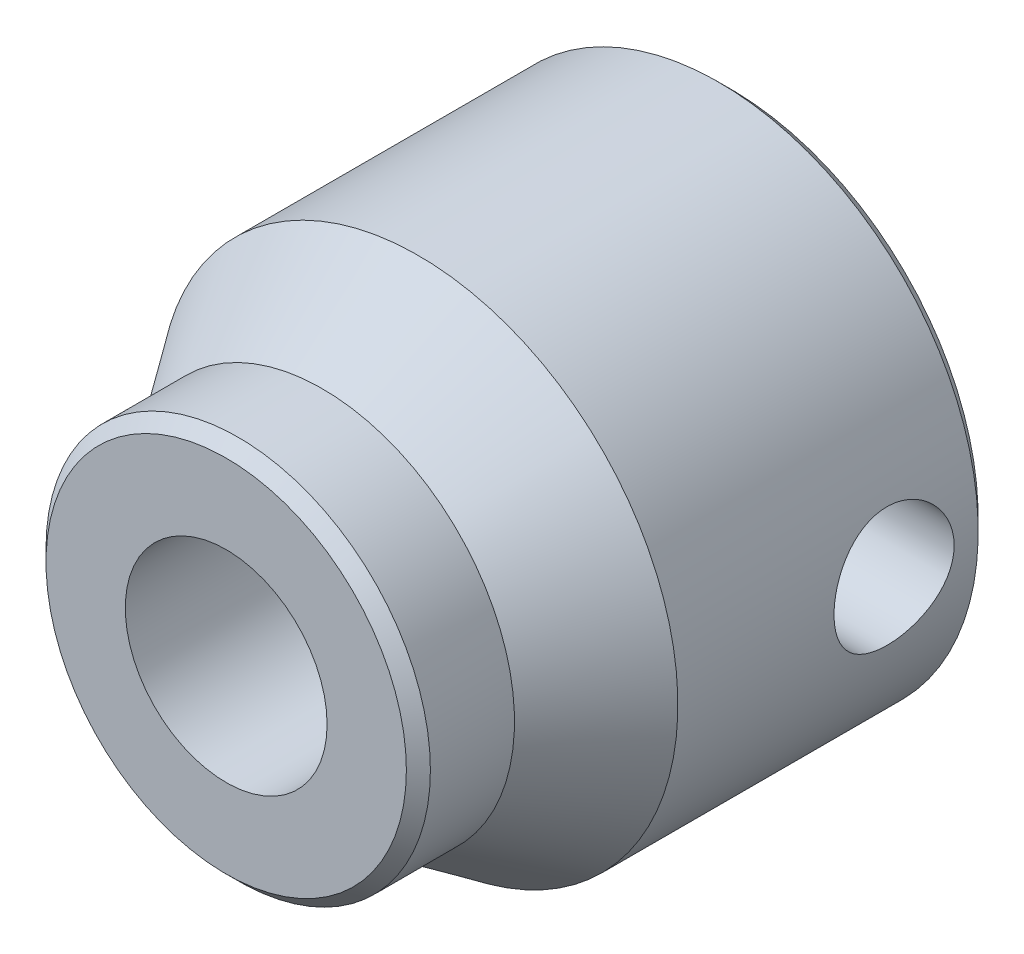
ISO-10303-21;
HEADER;
FILE_DESCRIPTION(('STEP AP214'),'2;1');
FILE_NAME('part.step','',(''),(''),'','','');
FILE_SCHEMA(('AUTOMOTIVE_DESIGN { 1 0 10303 214 1 1 1 1 }'));
ENDSEC;
DATA;
#1=APPLICATION_CONTEXT('core data for automotive mechanical design processes');
#2=APPLICATION_PROTOCOL_DEFINITION('international standard','automotive_design',2000,#1);
#3=PRODUCT_CONTEXT('',#1,'mechanical');
#4=PRODUCT('Part','Part','',(#3));
#5=PRODUCT_RELATED_PRODUCT_CATEGORY('part','',(#4));
#6=PRODUCT_DEFINITION_FORMATION('','',#4);
#7=PRODUCT_DEFINITION_CONTEXT('part definition',#1,'design');
#8=PRODUCT_DEFINITION('design','',#6,#7);
#9=PRODUCT_DEFINITION_SHAPE('','',#8);
#10=(LENGTH_UNIT() NAMED_UNIT(*) SI_UNIT(.MILLI.,.METRE.));
#11=(NAMED_UNIT(*) PLANE_ANGLE_UNIT() SI_UNIT($,.RADIAN.));
#12=(NAMED_UNIT(*) SI_UNIT($,.STERADIAN.) SOLID_ANGLE_UNIT());
#13=UNCERTAINTY_MEASURE_WITH_UNIT(LENGTH_MEASURE(1.E-05),#10,'distance_accuracy_value','');
#14=(GEOMETRIC_REPRESENTATION_CONTEXT(3) GLOBAL_UNCERTAINTY_ASSIGNED_CONTEXT((#13)) GLOBAL_UNIT_ASSIGNED_CONTEXT((#10,
#11,#12)) REPRESENTATION_CONTEXT('',''));
#15=CARTESIAN_POINT('',(0.,0.,0.));
#16=DIRECTION('',(0.,0.,1.));
#17=DIRECTION('',(1.,0.,0.));
#18=AXIS2_PLACEMENT_3D('',#15,#16,#17);
#19=CARTESIAN_POINT('',(0.,0.,0.));
#20=DIRECTION('',(0.,0.,-1.));
#21=DIRECTION('',(-1.,0.,0.));
#22=AXIS2_PLACEMENT_3D('',#19,#20,#21);
#23=CYLINDRICAL_SURFACE('',#22,2.5);
#24=CARTESIAN_POINT('',(2.5,0.,0.750000000000001));
#25=CARTESIAN_POINT('',(2.49999641755189,-0.065714953691233,0.750004127899377));
#26=CARTESIAN_POINT('',(2.49738113774397,-0.13150824962254,0.755212591402095));
#27=CARTESIAN_POINT('',(2.48717695046745,-0.261150294085531,0.775816100426148));
#28=CARTESIAN_POINT('',(2.47957859786229,-0.324995108391879,0.791230491247063));
#29=CARTESIAN_POINT('',(2.4602034925414,-0.448666931100717,0.831492260770994));
#30=CARTESIAN_POINT('',(2.448442989719,-0.508508503673974,0.856302980310016));
#31=CARTESIAN_POINT('',(2.42182220644723,-0.623090771008206,0.914463276706177));
#32=CARTESIAN_POINT('',(2.40696217041913,-0.677831867487562,0.947812180311066));
#33=CARTESIAN_POINT('',(2.37445322822571,-0.784384772202398,1.02439656185662));
#34=CARTESIAN_POINT('',(2.3566899890942,-0.835819013902639,1.06810809904955));
#35=CARTESIAN_POINT('',(2.32074962808431,-0.930974306083721,1.16315184905879));
#36=CARTESIAN_POINT('',(2.30257220261294,-0.974689478883457,1.21448981471555));
#37=CARTESIAN_POINT('',(2.26623688996684,-1.05656500056285,1.32810418690423));
#38=CARTESIAN_POINT('',(2.24818983712665,-1.09403166943955,1.39092012293239));
#39=CARTESIAN_POINT('',(2.21607473465401,-1.15771028361337,1.52295916998277));
#40=CARTESIAN_POINT('',(2.20200384508737,-1.18393026870792,1.59217766090344));
#41=CARTESIAN_POINT('',(2.18072333797261,-1.22266555273573,1.7308313817774));
#42=CARTESIAN_POINT('',(2.17315339479642,-1.23590732135055,1.80000556508424));
#43=CARTESIAN_POINT('',(2.1647736243566,-1.25053374163606,1.93997354722435));
#44=CARTESIAN_POINT('',(2.1639571167911,-1.25193011046634,2.01076567608894));
#45=CARTESIAN_POINT('',(2.16888662821561,-1.24335910896537,2.14285753039421));
#46=CARTESIAN_POINT('',(2.17385954577517,-1.23473069942103,2.20428003902881));
#47=CARTESIAN_POINT('',(2.18845285917313,-1.20867481132116,2.3246523867163));
#48=CARTESIAN_POINT('',(2.1980747353972,-1.19124452987206,2.38360143163164));
#49=CARTESIAN_POINT('',(2.22109345515926,-1.1477622254825,2.49903641570707));
#50=CARTESIAN_POINT('',(2.23457300829998,-1.12151883389499,2.55543299848224));
#51=CARTESIAN_POINT('',(2.26379255351755,-1.061302109585,2.66329286573751));
#52=CARTESIAN_POINT('',(2.27953355975238,-1.02732530476558,2.71475391950011));
#53=CARTESIAN_POINT('',(2.31391447379107,-0.947582568640985,2.81815156592903));
#54=CARTESIAN_POINT('',(2.33266887795933,-0.900868072961601,2.8693210919702));
#55=CARTESIAN_POINT('',(2.36934529125509,-0.799444473426716,2.96341927323863));
#56=CARTESIAN_POINT('',(2.38726689948501,-0.744731570717856,3.00634399004235));
#57=CARTESIAN_POINT('',(2.42127484103705,-0.62564563228981,3.08460707628716));
#58=CARTESIAN_POINT('',(2.43723730202509,-0.56094198949926,3.11950059055717));
#59=CARTESIAN_POINT('',(2.46447351401553,-0.425582769360996,3.17762128630376));
#60=CARTESIAN_POINT('',(2.47575098679441,-0.354931970331595,3.20085773126896));
#61=CARTESIAN_POINT('',(2.49155417176795,-0.215958114575877,3.23309425464584));
#62=CARTESIAN_POINT('',(2.4965617287664,-0.147926913185405,3.24311404468347));
#63=CARTESIAN_POINT('',(2.50091266823877,-0.0109744999366918,3.25183091391811));
#64=CARTESIAN_POINT('',(2.5002587340164,0.0579462748373768,3.25053335704935));
#65=CARTESIAN_POINT('',(2.49363990316801,0.189041214982492,3.23724163947656));
#66=CARTESIAN_POINT('',(2.48809057110237,0.251324260062443,3.22608433408746));
#67=CARTESIAN_POINT('',(2.47277714143524,0.373008615377396,3.19470241013114));
#68=CARTESIAN_POINT('',(2.46301257917916,0.432409607113746,3.1744767919333));
#69=CARTESIAN_POINT('',(2.43980314267087,0.548610760562081,3.12500191695853));
#70=CARTESIAN_POINT('',(2.42626102212424,0.605287996257691,3.09551118735398));
#71=CARTESIAN_POINT('',(2.39679967896386,0.71307670212365,3.02861558044245));
#72=CARTESIAN_POINT('',(2.38087944457231,0.764185787219102,2.99120733175821));
#73=CARTESIAN_POINT('',(2.34635276671831,0.864709611613316,2.90529946833391));
#74=CARTESIAN_POINT('',(2.32763606060552,0.913465097280798,2.85607141443304));
#75=CARTESIAN_POINT('',(2.29077989504843,1.00232040139155,2.75009356091337));
#76=CARTESIAN_POINT('',(2.27264084226908,1.04241423211355,2.69333860147953));
#77=CARTESIAN_POINT('',(2.23813990282585,1.11463489312212,2.57044543224961));
#78=CARTESIAN_POINT('',(2.2219066207934,1.1462818698483,2.50398591723926));
#79=CARTESIAN_POINT('',(2.19467590460158,1.19760353251725,2.36561241538435));
#80=CARTESIAN_POINT('',(2.18367172800773,1.21729364485946,2.29370559187352));
#81=CARTESIAN_POINT('',(2.16951876260834,1.2423271093121,2.15386222142319));
#82=CARTESIAN_POINT('',(2.16571729325614,1.24886624550108,2.0862071832137));
#83=CARTESIAN_POINT('',(2.16456693307719,1.25086144297598,1.95069116603659));
#84=CARTESIAN_POINT('',(2.16721524534441,1.2463223082805,1.88283028907571));
#85=CARTESIAN_POINT('',(2.17797327562531,1.22740765699033,1.75564562308498));
#86=CARTESIAN_POINT('',(2.18553868102992,1.2140103929285,1.6961244123195));
#87=CARTESIAN_POINT('',(2.20463770234897,1.17896919778081,1.58023985071912));
#88=CARTESIAN_POINT('',(2.21617259462095,1.15732261394976,1.52387752238504));
#89=CARTESIAN_POINT('',(2.2428566295566,1.10476968162585,1.41171893626674));
#90=CARTESIAN_POINT('',(2.25819652995238,1.07333892227057,1.35621512271287));
#91=CARTESIAN_POINT('',(2.29044164543238,1.00268871454579,1.25090682977427));
#92=CARTESIAN_POINT('',(2.30734767243153,0.963465214048309,1.20110533685189));
#93=CARTESIAN_POINT('',(2.34327903949141,0.8727541583308,1.10232252205298));
#94=CARTESIAN_POINT('',(2.36231229139336,0.820355528762713,1.0541761220476));
#95=CARTESIAN_POINT('',(2.3984719031886,0.707693507775348,0.96717127072046));
#96=CARTESIAN_POINT('',(2.4155972326005,0.64742590407098,0.928317825717139));
#97=CARTESIAN_POINT('',(2.44622511981379,0.519914496024932,0.860954546547245));
#98=CARTESIAN_POINT('',(2.45970120703636,0.452624379918267,0.832519788235707));
#99=CARTESIAN_POINT('',(2.48126676704332,0.313427626617738,0.787739790101311));
#100=CARTESIAN_POINT('',(2.48937154216165,0.241534749528956,0.771360191463029));
#101=CARTESIAN_POINT('',(2.49619327387079,0.140752433104229,0.757628236155189));
#102=CARTESIAN_POINT('',(2.49761706674002,0.112702349299373,0.754771698920477));
#103=CARTESIAN_POINT('',(2.49952121222331,0.0564396647589471,0.750956668103994));
#104=CARTESIAN_POINT('',(2.50000153879704,0.0282270595592268,0.749998226911001));
#105=CARTESIAN_POINT('',(2.5,0.,0.750000000000001));
#106=B_SPLINE_CURVE_WITH_KNOTS('',3,(#24,#25,#26,#27,#28,#29,#30,#31,#32,#33,#34,#35,#36,#37,
#38,#39,#40,#41,#42,#43,#44,#45,#46,#47,#48,#49,#50,#51,#52,#53,#54,#55,#56,#57,#58,#59,#60,#61,
#62,#63,#64,#65,#66,#67,#68,#69,#70,#71,#72,#73,#74,#75,#76,#77,#78,#79,#80,#81,#82,#83,#84,#85,
#86,#87,#88,#89,#90,#91,#92,#93,#94,#95,#96,#97,#98,#99,#100,#101,#102,#103,#104,#105),
.UNSPECIFIED.,.T.,.F.,(4,2,2,2,2,2,2,2,2,2,2,2,2,2,2,2,2,2,2,2,2,2,2,2,2,2,2,2,2,2,2,2,2,2,2,2,
2,2,2,2,4),(0.,0.197030321775365,0.394435187136497,0.591077694365372,0.787704700726959,
0.99622719839761,1.20490779706754,1.42977158038441,1.65447434872851,1.86572515175287,
2.07676696661275,2.26257140511651,2.44843504907098,2.63862800210609,2.82890651575277,
3.04331176667348,3.25781918248358,3.4822877776805,3.70657771140349,3.91229113089182,
4.11790705639345,4.30758633132652,4.49728652038664,4.69241070034873,4.88761813435423,
5.10199513305523,5.31651985769289,5.54143352699592,5.76605639925971,5.96911634372966,
6.17208824825006,6.35572412805228,6.53941910979597,6.73545570969517,6.93159451423696,
7.15156553440622,7.37165479220715,7.59330017078656,7.81431135781162,7.89894100172121,
7.98357298143558),.UNSPECIFIED.);
#107=CARTESIAN_POINT('',(2.5,0.,0.750000000000001));
#108=VERTEX_POINT('',#107);
#109=EDGE_CURVE('E84',#108,#108,#106,.T.);
#110=ORIENTED_EDGE('',*,*,#109,.F.);
#111=EDGE_LOOP('',(#110));
#112=FACE_BOUND('',#111,.T.);
#113=CARTESIAN_POINT('',(0.,0.,0.));
#114=DIRECTION('',(0.,0.,-1.));
#115=DIRECTION('',(-1.,0.,0.));
#116=AXIS2_PLACEMENT_3D('',#113,#114,#115);
#117=CIRCLE('',#116,2.5);
#118=CARTESIAN_POINT('',(-2.5,0.,0.));
#119=VERTEX_POINT('',#118);
#120=EDGE_CURVE('E67',#119,#119,#117,.T.);
#121=ORIENTED_EDGE('',*,*,#120,.T.);
#122=EDGE_LOOP('',(#121));
#123=FACE_BOUND('',#122,.T.);
#124=CARTESIAN_POINT('',(0.,0.,6.));
#125=DIRECTION('',(0.,0.,-1.));
#126=DIRECTION('',(-1.,0.,0.));
#127=AXIS2_PLACEMENT_3D('',#124,#125,#126);
#128=CIRCLE('',#127,2.5);
#129=CARTESIAN_POINT('',(-2.5,0.,6.));
#130=VERTEX_POINT('',#129);
#131=EDGE_CURVE('E58',#130,#130,#128,.T.);
#132=ORIENTED_EDGE('',*,*,#131,.F.);
#133=EDGE_LOOP('',(#132));
#134=FACE_BOUND('',#133,.T.);
#135=ADVANCED_FACE('F37',(#112,#123,#134),#23,.F.);
#136=CARTESIAN_POINT('',(-1.,0.,6.));
#137=DIRECTION('',(0.,0.,-1.));
#138=DIRECTION('',(-1.,0.,0.));
#139=AXIS2_PLACEMENT_3D('',#136,#137,#138);
#140=PLANE('',#139);
#141=CARTESIAN_POINT('',(0.,0.,6.));
#142=DIRECTION('',(0.,0.,-1.));
#143=DIRECTION('',(-1.,0.,0.));
#144=AXIS2_PLACEMENT_3D('',#141,#142,#143);
#145=CIRCLE('',#144,2.09999999999999);
#146=CARTESIAN_POINT('',(-2.09999999999999,0.,6.));
#147=VERTEX_POINT('',#146);
#148=EDGE_CURVE('E70',#147,#147,#145,.T.);
#149=ORIENTED_EDGE('',*,*,#148,.F.);
#150=EDGE_LOOP('',(#149));
#151=FACE_BOUND('',#150,.T.);
#152=ORIENTED_EDGE('',*,*,#131,.T.);
#153=EDGE_LOOP('',(#152));
#154=FACE_BOUND('',#153,.T.);
#155=ADVANCED_FACE('F114',(#151,#154),#140,.T.);
#156=CARTESIAN_POINT('',(-1.,0.,10.5));
#157=DIRECTION('',(0.,0.,1.));
#158=DIRECTION('',(1.,0.,0.));
#159=AXIS2_PLACEMENT_3D('',#156,#157,#158);
#160=PLANE('',#159);
#161=CARTESIAN_POINT('',(0.,0.,10.5));
#162=DIRECTION('',(0.,0.,1.));
#163=DIRECTION('',(1.,0.,0.));
#164=AXIS2_PLACEMENT_3D('',#161,#162,#163);
#165=CIRCLE('',#164,3.75);
#166=CARTESIAN_POINT('',(3.75,0.,10.5));
#167=VERTEX_POINT('',#166);
#168=EDGE_CURVE('E10',#167,#167,#165,.T.);
#169=ORIENTED_EDGE('',*,*,#168,.T.);
#170=EDGE_LOOP('',(#169));
#171=FACE_BOUND('',#170,.T.);
#172=CARTESIAN_POINT('',(0.,0.,10.5));
#173=DIRECTION('',(0.,0.,1.));
#174=DIRECTION('',(1.,0.,0.));
#175=AXIS2_PLACEMENT_3D('',#172,#173,#174);
#176=CIRCLE('',#175,2.09999999999999);
#177=CARTESIAN_POINT('',(2.09999999999999,0.,10.5));
#178=VERTEX_POINT('',#177);
#179=EDGE_CURVE('E73',#178,#178,#176,.T.);
#180=ORIENTED_EDGE('',*,*,#179,.F.);
#181=EDGE_LOOP('',(#180));
#182=FACE_BOUND('',#181,.T.);
#183=ADVANCED_FACE('F120',(#171,#182),#160,.T.);
#184=CARTESIAN_POINT('',(0.,0.,0.));
#185=DIRECTION('',(0.,0.,-1.));
#186=DIRECTION('',(-1.,0.,0.));
#187=AXIS2_PLACEMENT_3D('',#184,#185,#186);
#188=CYLINDRICAL_SURFACE('',#187,4.);
#189=CARTESIAN_POINT('',(0.,0.,10.25));
#190=DIRECTION('',(0.,0.,1.));
#191=DIRECTION('',(1.,0.,0.));
#192=AXIS2_PLACEMENT_3D('',#189,#190,#191);
#193=CIRCLE('',#192,4.);
#194=CARTESIAN_POINT('',(4.,0.,10.25));
#195=VERTEX_POINT('',#194);
#196=EDGE_CURVE('E45',#195,#195,#193,.F.);
#197=ORIENTED_EDGE('',*,*,#196,.T.);
#198=EDGE_LOOP('',(#197));
#199=FACE_BOUND('',#198,.T.);
#200=CARTESIAN_POINT('',(0.,0.,8.5));
#201=DIRECTION('',(0.,0.,-1.));
#202=DIRECTION('',(-1.,0.,0.));
#203=AXIS2_PLACEMENT_3D('',#200,#201,#202);
#204=CIRCLE('',#203,4.);
#205=CARTESIAN_POINT('',(-4.,0.,8.5));
#206=VERTEX_POINT('',#205);
#207=EDGE_CURVE('E61',#206,#206,#204,.T.);
#208=ORIENTED_EDGE('',*,*,#207,.F.);
#209=EDGE_LOOP('',(#208));
#210=FACE_BOUND('',#209,.T.);
#211=ADVANCED_FACE('F144',(#199,#210),#188,.T.);
#212=CARTESIAN_POINT('',(0.,0.,6.5));
#213=DIRECTION('',(0.,0.,-1.));
#214=DIRECTION('',(-1.,0.,0.));
#215=AXIS2_PLACEMENT_3D('',#212,#213,#214);
#216=CONICAL_SURFACE('',#215,5.4,0.610725964389208);
#217=ORIENTED_EDGE('',*,*,#207,.T.);
#218=EDGE_LOOP('',(#217));
#219=FACE_BOUND('',#218,.T.);
#220=CARTESIAN_POINT('',(0.,0.,6.5));
#221=DIRECTION('',(0.,0.,-1.));
#222=DIRECTION('',(-1.,0.,0.));
#223=AXIS2_PLACEMENT_3D('',#220,#221,#222);
#224=CIRCLE('',#223,5.4);
#225=CARTESIAN_POINT('',(-5.4,0.,6.5));
#226=VERTEX_POINT('',#225);
#227=EDGE_CURVE('E64',#226,#226,#224,.T.);
#228=ORIENTED_EDGE('',*,*,#227,.F.);
#229=EDGE_LOOP('',(#228));
#230=FACE_BOUND('',#229,.T.);
#231=ADVANCED_FACE('F110',(#219,#230),#216,.T.);
#232=CARTESIAN_POINT('',(0.,0.,0.));
#233=DIRECTION('',(0.,0.,-1.));
#234=DIRECTION('',(-1.,0.,0.));
#235=AXIS2_PLACEMENT_3D('',#232,#233,#234);
#236=CYLINDRICAL_SURFACE('',#235,5.4);
#237=CARTESIAN_POINT('',(0.,0.,0.249999999999995));
#238=DIRECTION('',(0.,0.,-1.));
#239=DIRECTION('',(-1.,0.,0.));
#240=AXIS2_PLACEMENT_3D('',#237,#238,#239);
#241=CIRCLE('',#240,5.4);
#242=CARTESIAN_POINT('',(-5.4,0.,0.249999999999995));
#243=VERTEX_POINT('',#242);
#244=EDGE_CURVE('E49',#243,#243,#241,.F.);
#245=ORIENTED_EDGE('',*,*,#244,.T.);
#246=EDGE_LOOP('',(#245));
#247=FACE_BOUND('',#246,.T.);
#248=CARTESIAN_POINT('',(5.4,0.,0.750000000000001));
#249=CARTESIAN_POINT('',(5.39999874823438,0.0692241871145403,0.750002211770963));
#250=CARTESIAN_POINT('',(5.39865546800572,0.138474266427772,0.755769777927965));
#251=CARTESIAN_POINT('',(5.39342675426803,0.275000425366631,0.778659560700592));
#252=CARTESIAN_POINT('',(5.38953965210246,0.342275178961732,0.795789230551391));
#253=CARTESIAN_POINT('',(5.37965516979212,0.472858483968851,0.840832442091347));
#254=CARTESIAN_POINT('',(5.37366012568423,0.536171334869416,0.868734049579805));
#255=CARTESIAN_POINT('',(5.36020341061013,0.657216106152046,0.934489581370946));
#256=CARTESIAN_POINT('',(5.35274174258654,0.714948037731248,0.97234348570552));
#257=CARTESIAN_POINT('',(5.33701743019704,0.824223728513662,1.0576434492428));
#258=CARTESIAN_POINT('',(5.32874387739558,0.875653654684864,1.1052333370637));
#259=CARTESIAN_POINT('',(5.31240337894845,0.969877453577131,1.20834591811521));
#260=CARTESIAN_POINT('',(5.30433645361578,1.01267048005084,1.26386938777234));
#261=CARTESIAN_POINT('',(5.2892141261743,1.08892093571322,1.38213125549625));
#262=CARTESIAN_POINT('',(5.28217265376136,1.12225476741282,1.44495128561076));
#263=CARTESIAN_POINT('',(5.27005610560817,1.17784701650963,1.57549178185647));
#264=CARTESIAN_POINT('',(5.26498076415844,1.20010693058863,1.64321158434705));
#265=CARTESIAN_POINT('',(5.25748265119255,1.23253847327747,1.78038763342959));
#266=CARTESIAN_POINT('',(5.2550154349981,1.24291290618177,1.84979344937481));
#267=CARTESIAN_POINT('',(5.25287961956346,1.25191004217409,1.98940090166641));
#268=CARTESIAN_POINT('',(5.25321063325227,1.25053437061961,2.05960242660308));
#269=CARTESIAN_POINT('',(5.25659375047557,1.23623300176578,2.19728284421562));
#270=CARTESIAN_POINT('',(5.25958979574762,1.22354523877694,2.26478804070032));
#271=CARTESIAN_POINT('',(5.2678764915052,1.18735782432143,2.39668487670125));
#272=CARTESIAN_POINT('',(5.2731672844797,1.16385750145935,2.46107632259772));
#273=CARTESIAN_POINT('',(5.28550107960884,1.10649981926167,2.58557453093805));
#274=CARTESIAN_POINT('',(5.29255911403959,1.07255300269372,2.64563852802482));
#275=CARTESIAN_POINT('',(5.30762320463089,0.995328718186158,2.75930459854825));
#276=CARTESIAN_POINT('',(5.31562940449809,0.952049835034112,2.81290568995769));
#277=CARTESIAN_POINT('',(5.33192650722274,0.856141032424575,2.9134918693618));
#278=CARTESIAN_POINT('',(5.34021959983535,0.803309372870152,2.96028445401572));
#279=CARTESIAN_POINT('',(5.35597952063802,0.690452447512654,3.04437901499062));
#280=CARTESIAN_POINT('',(5.36344633016309,0.630427019272688,3.08168077694731));
#281=CARTESIAN_POINT('',(5.37674137922928,0.504635960206347,3.14579134647603));
#282=CARTESIAN_POINT('',(5.38256529931455,0.438855782479791,3.17257256478928));
#283=CARTESIAN_POINT('',(5.39188660170977,0.30356339515595,3.21464627002836));
#284=CARTESIAN_POINT('',(5.39538436395879,0.234051797029329,3.22994063319308));
#285=CARTESIAN_POINT('',(5.39960432194415,0.0949188474226058,3.24832100682319));
#286=CARTESIAN_POINT('',(5.40038621683971,0.0253339536305773,3.25166964888367));
#287=CARTESIAN_POINT('',(5.39925471054082,-0.113401199396407,3.24677870165908));
#288=CARTESIAN_POINT('',(5.39734151538226,-0.182551491450131,3.23853999821056));
#289=CARTESIAN_POINT('',(5.39107270805315,-0.317567653128891,3.21092556690345));
#290=CARTESIAN_POINT('',(5.38674779900457,-0.383463694391253,3.19168976509555));
#291=CARTESIAN_POINT('',(5.37614070405043,-0.511092660604726,3.14278425017143));
#292=CARTESIAN_POINT('',(5.3698583382899,-0.572825202371076,3.11311357824669));
#293=CARTESIAN_POINT('',(5.35588743525236,-0.691444779334462,3.04364847732382));
#294=CARTESIAN_POINT('',(5.34817839030347,-0.748240639647342,3.00370257610649));
#295=CARTESIAN_POINT('',(5.33224710804932,-0.854416896018498,2.91501804549652));
#296=CARTESIAN_POINT('',(5.32402479563046,-0.903796203090457,2.86627812717025));
#297=CARTESIAN_POINT('',(5.30778399091491,-0.994793544081783,2.76017783658924));
#298=CARTESIAN_POINT('',(5.29977329933032,-1.0362287089936,2.70265919800381));
#299=CARTESIAN_POINT('',(5.28505640511214,-1.10885407052095,2.58132673225702));
#300=CARTESIAN_POINT('',(5.27835014441881,-1.14004472315851,2.51751318547033));
#301=CARTESIAN_POINT('',(5.26706995749014,-1.19107407331668,2.38575053162684));
#302=CARTESIAN_POINT('',(5.2624836492151,-1.21097884732069,2.31782812839382));
#303=CARTESIAN_POINT('',(5.2559438279697,-1.23905858603521,2.17948120782013));
#304=CARTESIAN_POINT('',(5.25398983488665,-1.24723568979417,2.10905714916654));
#305=CARTESIAN_POINT('',(5.25296867632895,-1.2515285845306,1.96955615019909));
#306=CARTESIAN_POINT('',(5.25383190937952,-1.24793516606778,1.9004885130342));
#307=CARTESIAN_POINT('',(5.25818914739366,-1.22944516739717,1.76397209528447));
#308=CARTESIAN_POINT('',(5.26168311330701,-1.21454875496928,1.69652329068526));
#309=CARTESIAN_POINT('',(5.27087224339566,-1.17402355997323,1.56542361089538));
#310=CARTESIAN_POINT('',(5.27655773123556,-1.14844191549021,1.50175744065481));
#311=CARTESIAN_POINT('',(5.28949203841655,-1.08731126166201,1.37957919121915));
#312=CARTESIAN_POINT('',(5.2967410425912,-1.05176107372034,1.32106772254817));
#313=CARTESIAN_POINT('',(5.31218981239259,-0.970758826498259,1.20943725861768));
#314=CARTESIAN_POINT('',(5.32040732565605,-0.92510163582206,1.15646954095245));
#315=CARTESIAN_POINT('',(5.33675342745657,-0.825590992830997,1.05885252724268));
#316=CARTESIAN_POINT('',(5.34488199482159,-0.771735632696653,1.01420517284684));
#317=CARTESIAN_POINT('',(5.36027855985255,-0.656388355565246,0.933853560611235));
#318=CARTESIAN_POINT('',(5.36753191208641,-0.594794510125286,0.898292637731052));
#319=CARTESIAN_POINT('',(5.38021121124879,-0.466345339684815,0.838085876748606));
#320=CARTESIAN_POINT('',(5.3856386038694,-0.399494229079049,0.813431398643538));
#321=CARTESIAN_POINT('',(5.39315038381651,-0.277203903682884,0.779846767779616));
#322=CARTESIAN_POINT('',(5.39570241420179,-0.222397521091905,0.768676664335558));
#323=CARTESIAN_POINT('',(5.3991276811903,-0.111733009859767,0.753752592309421));
#324=CARTESIAN_POINT('',(5.40000101037414,-0.0558749393909186,0.749998214748724));
#325=CARTESIAN_POINT('',(5.4,0.,0.750000000000001));
#326=B_SPLINE_CURVE_WITH_KNOTS('',3,(#248,#249,#250,#251,#252,#253,#254,#255,#256,#257,#258,
#259,#260,#261,#262,#263,#264,#265,#266,#267,#268,#269,#270,#271,#272,#273,#274,#275,#276,#277,
#278,#279,#280,#281,#282,#283,#284,#285,#286,#287,#288,#289,#290,#291,#292,#293,#294,#295,#296,
#297,#298,#299,#300,#301,#302,#303,#304,#305,#306,#307,#308,#309,#310,#311,#312,#313,#314,#315,
#316,#317,#318,#319,#320,#321,#322,#323,#324,#325),.UNSPECIFIED.,.T.,.F.,(4,2,2,2,2,2,2,2,2,2,2,
2,2,2,2,2,2,2,2,2,2,2,2,2,2,2,2,2,2,2,2,2,2,2,2,2,2,2,4),(0.,0.207467946105603,
0.415072120385802,0.622446947561193,0.829821358666675,1.04051486741415,1.25122900999614,
1.46458145535715,1.67790505749033,1.88753176908611,2.09712948410295,2.30241996008224,
2.50772318509512,2.71483586958108,2.92197998492394,3.1341595790516,3.34634396514453,
3.55908113091197,3.77178354107411,3.97977975138832,4.1877600615439,4.39315114378166,
4.59856110332142,4.80719248561258,5.01585447175303,5.2288581378352,5.44185232103247,
5.65358623747827,5.86528153016325,6.07178671705002,6.27828883866533,6.48388943660925,
6.68951435329084,6.89977416821969,7.11008298832518,7.32352890318486,7.53680542367441,
7.70427432097337,7.87173398207459),.UNSPECIFIED.);
#327=CARTESIAN_POINT('',(5.4,0.,0.750000000000001));
#328=VERTEX_POINT('',#327);
#329=EDGE_CURVE('E76',#328,#328,#326,.T.);
#330=ORIENTED_EDGE('',*,*,#329,.F.);
#331=EDGE_LOOP('',(#330));
#332=FACE_BOUND('',#331,.T.);
#333=ORIENTED_EDGE('',*,*,#227,.T.);
#334=EDGE_LOOP('',(#333));
#335=FACE_BOUND('',#334,.T.);
#336=ADVANCED_FACE('F89',(#247,#332,#335),#236,.T.);
#337=CARTESIAN_POINT('',(-5.4,0.,0.));
#338=DIRECTION('',(0.,0.,-1.));
#339=DIRECTION('',(-1.,0.,0.));
#340=AXIS2_PLACEMENT_3D('',#337,#338,#339);
#341=PLANE('',#340);
#342=CARTESIAN_POINT('',(0.,0.,0.));
#343=DIRECTION('',(0.,0.,-1.));
#344=DIRECTION('',(-1.,0.,0.));
#345=AXIS2_PLACEMENT_3D('',#342,#343,#344);
#346=CIRCLE('',#345,5.15000000000001);
#347=CARTESIAN_POINT('',(-5.15000000000001,0.,0.));
#348=VERTEX_POINT('',#347);
#349=EDGE_CURVE('E53',#348,#348,#346,.T.);
#350=ORIENTED_EDGE('',*,*,#349,.T.);
#351=EDGE_LOOP('',(#350));
#352=FACE_BOUND('',#351,.T.);
#353=ORIENTED_EDGE('',*,*,#120,.F.);
#354=EDGE_LOOP('',(#353));
#355=FACE_BOUND('',#354,.T.);
#356=ADVANCED_FACE('F103',(#352,#355),#341,.T.);
#357=CARTESIAN_POINT('',(0.,0.,10.5));
#358=DIRECTION('',(0.,0.,1.));
#359=DIRECTION('',(1.,0.,0.));
#360=AXIS2_PLACEMENT_3D('',#357,#358,#359);
#361=CYLINDRICAL_SURFACE('',#360,2.09999999999999);
#362=ORIENTED_EDGE('',*,*,#148,.T.);
#363=EDGE_LOOP('',(#362));
#364=FACE_BOUND('',#363,.T.);
#365=ORIENTED_EDGE('',*,*,#179,.T.);
#366=EDGE_LOOP('',(#365));
#367=FACE_BOUND('',#366,.T.);
#368=ADVANCED_FACE('F97',(#364,#367),#361,.F.);
#369=CARTESIAN_POINT('',(5.4,0.,2.));
#370=DIRECTION('',(1.,0.,0.));
#371=DIRECTION('',(0.,0.,-1.));
#372=AXIS2_PLACEMENT_3D('',#369,#370,#371);
#373=CYLINDRICAL_SURFACE('',#372,1.25);
#374=ORIENTED_EDGE('',*,*,#329,.T.);
#375=EDGE_LOOP('',(#374));
#376=FACE_BOUND('',#375,.T.);
#377=ORIENTED_EDGE('',*,*,#109,.T.);
#378=EDGE_LOOP('',(#377));
#379=FACE_BOUND('',#378,.T.);
#380=ADVANCED_FACE('F93',(#376,#379),#373,.F.);
#381=CARTESIAN_POINT('',(0.,0.,0.));
#382=DIRECTION('',(0.,0.,1.));
#383=DIRECTION('',(1.,0.,0.));
#384=AXIS2_PLACEMENT_3D('',#381,#382,#383);
#385=CONICAL_SURFACE('',#384,5.15000000000001,0.785398163397445);
#386=ORIENTED_EDGE('',*,*,#244,.F.);
#387=EDGE_LOOP('',(#386));
#388=FACE_BOUND('',#387,.T.);
#389=ORIENTED_EDGE('',*,*,#349,.F.);
#390=EDGE_LOOP('',(#389));
#391=FACE_BOUND('',#390,.T.);
#392=ADVANCED_FACE('F96',(#388,#391),#385,.T.);
#393=CARTESIAN_POINT('',(0.,0.,10.25));
#394=DIRECTION('',(0.,0.,-1.));
#395=DIRECTION('',(-1.,0.,0.));
#396=AXIS2_PLACEMENT_3D('',#393,#394,#395);
#397=CONICAL_SURFACE('',#396,4.,0.785398163397452);
#398=ORIENTED_EDGE('',*,*,#168,.F.);
#399=EDGE_LOOP('',(#398));
#400=FACE_BOUND('',#399,.T.);
#401=ORIENTED_EDGE('',*,*,#196,.F.);
#402=EDGE_LOOP('',(#401));
#403=FACE_BOUND('',#402,.T.);
#404=ADVANCED_FACE('F40',(#400,#403),#397,.T.);
#405=CLOSED_SHELL('',(#135,#155,#183,#211,#231,#336,#356,#368,#380,#392,#404));
#406=MANIFOLD_SOLID_BREP('B2',#405);
#407=ADVANCED_BREP_SHAPE_REPRESENTATION('',(#18,#406),#14);
#408=SHAPE_DEFINITION_REPRESENTATION(#9,#407);
ENDSEC;
END-ISO-10303-21;
